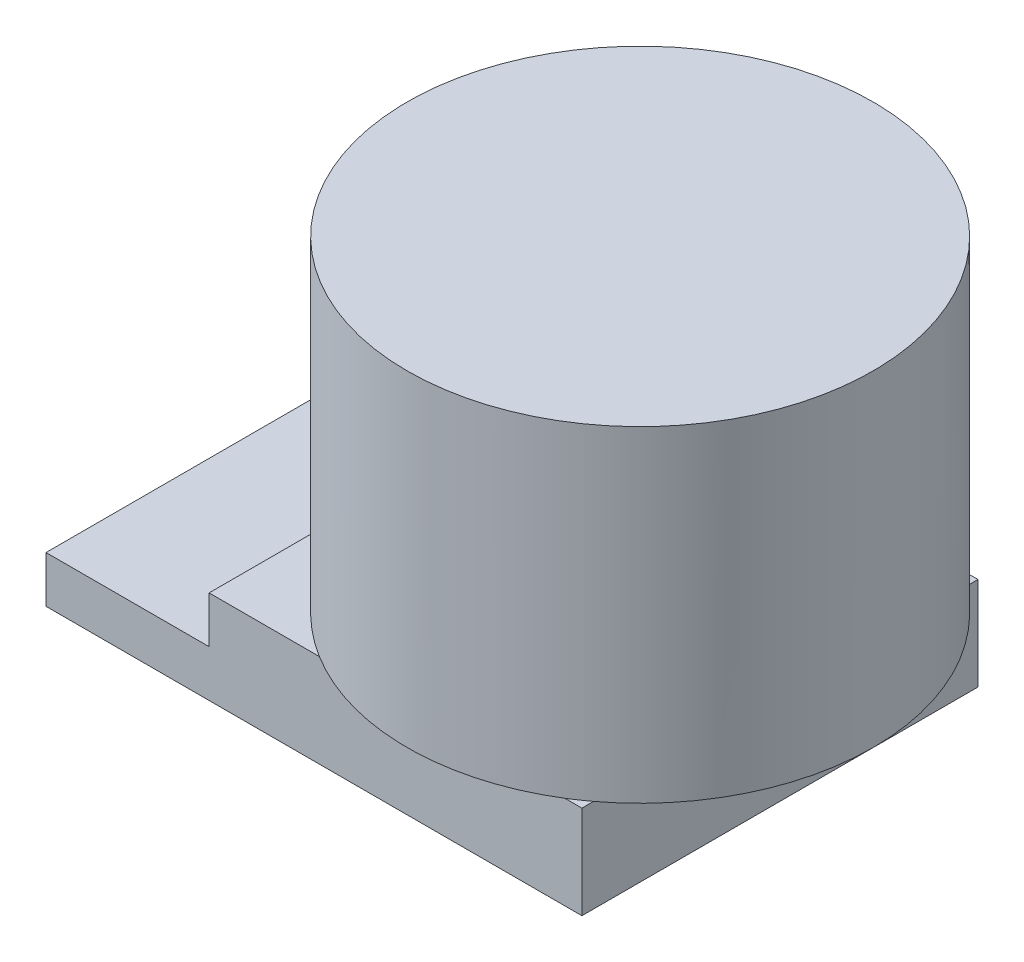
ISO-10303-21;
HEADER;
FILE_DESCRIPTION(('STEP AP214'),'2;1');
FILE_NAME('part.step','',(''),(''),'','','');
FILE_SCHEMA(('AUTOMOTIVE_DESIGN { 1 0 10303 214 1 1 1 1 }'));
ENDSEC;
DATA;
#1=APPLICATION_CONTEXT('core data for automotive mechanical design processes');
#2=APPLICATION_PROTOCOL_DEFINITION('international standard','automotive_design',2000,#1);
#3=PRODUCT_CONTEXT('',#1,'mechanical');
#4=PRODUCT('Part','Part','',(#3));
#5=PRODUCT_RELATED_PRODUCT_CATEGORY('part','',(#4));
#6=PRODUCT_DEFINITION_FORMATION('','',#4);
#7=PRODUCT_DEFINITION_CONTEXT('part definition',#1,'design');
#8=PRODUCT_DEFINITION('design','',#6,#7);
#9=PRODUCT_DEFINITION_SHAPE('','',#8);
#10=(LENGTH_UNIT() NAMED_UNIT(*) SI_UNIT(.MILLI.,.METRE.));
#11=(NAMED_UNIT(*) PLANE_ANGLE_UNIT() SI_UNIT($,.RADIAN.));
#12=(NAMED_UNIT(*) SI_UNIT($,.STERADIAN.) SOLID_ANGLE_UNIT());
#13=UNCERTAINTY_MEASURE_WITH_UNIT(LENGTH_MEASURE(1.E-05),#10,'distance_accuracy_value','');
#14=(GEOMETRIC_REPRESENTATION_CONTEXT(3) GLOBAL_UNCERTAINTY_ASSIGNED_CONTEXT((#13)) GLOBAL_UNIT_ASSIGNED_CONTEXT((#10,
#11,#12)) REPRESENTATION_CONTEXT('',''));
#15=CARTESIAN_POINT('',(0.,0.,0.));
#16=DIRECTION('',(0.,0.,1.));
#17=DIRECTION('',(1.,0.,0.));
#18=AXIS2_PLACEMENT_3D('',#15,#16,#17);
#19=CARTESIAN_POINT('',(-5.75,2.,-4.25));
#20=DIRECTION('',(1.,0.,0.));
#21=DIRECTION('',(0.,0.,-1.));
#22=AXIS2_PLACEMENT_3D('',#19,#20,#21);
#23=PLANE('',#22);
#24=DIRECTION('',(0.,0.,1.));
#25=VECTOR('',#24,1.);
#26=CARTESIAN_POINT('',(-5.75,1.,-4.25));
#27=LINE('',#26,#25);
#28=CARTESIAN_POINT('',(-5.75,1.,-4.25));
#29=VERTEX_POINT('',#28);
#30=CARTESIAN_POINT('',(-5.75,1.,4.25));
#31=VERTEX_POINT('',#30);
#32=EDGE_CURVE('E109',#29,#31,#27,.T.);
#33=ORIENTED_EDGE('',*,*,#32,.F.);
#34=DIRECTION('',(0.,-1.,0.));
#35=VECTOR('',#34,1.);
#36=CARTESIAN_POINT('',(-5.75,2.,-4.25));
#37=LINE('',#36,#35);
#38=CARTESIAN_POINT('',(-5.75,0.,-4.25));
#39=VERTEX_POINT('',#38);
#40=EDGE_CURVE('E143',#29,#39,#37,.T.);
#41=ORIENTED_EDGE('',*,*,#40,.T.);
#42=DIRECTION('',(0.,0.,1.));
#43=VECTOR('',#42,1.);
#44=CARTESIAN_POINT('',(-5.75,0.,-4.25));
#45=LINE('',#44,#43);
#46=CARTESIAN_POINT('',(-5.75,0.,4.25));
#47=VERTEX_POINT('',#46);
#48=EDGE_CURVE('E130',#39,#47,#45,.T.);
#49=ORIENTED_EDGE('',*,*,#48,.T.);
#50=DIRECTION('',(0.,-1.,0.));
#51=VECTOR('',#50,1.);
#52=CARTESIAN_POINT('',(-5.75,2.,4.25));
#53=LINE('',#52,#51);
#54=EDGE_CURVE('E36',#31,#47,#53,.T.);
#55=ORIENTED_EDGE('',*,*,#54,.F.);
#56=EDGE_LOOP('',(#33,#41,#49,#55));
#57=FACE_BOUND('',#56,.T.);
#58=ADVANCED_FACE('F33',(#57),#23,.F.);
#59=CARTESIAN_POINT('',(0.,2.,0.));
#60=DIRECTION('',(0.,1.,0.));
#61=DIRECTION('',(0.,0.,1.));
#62=AXIS2_PLACEMENT_3D('',#59,#60,#61);
#63=PLANE('',#62);
#64=DIRECTION('',(0.,0.,-1.));
#65=VECTOR('',#64,1.);
#66=CARTESIAN_POINT('',(-2.25,2.,-4.25));
#67=LINE('',#66,#65);
#68=CARTESIAN_POINT('',(-2.25,2.,4.25));
#69=VERTEX_POINT('',#68);
#70=CARTESIAN_POINT('',(-2.25,2.,0.));
#71=VERTEX_POINT('',#70);
#72=EDGE_CURVE('E50',#69,#71,#67,.T.);
#73=ORIENTED_EDGE('',*,*,#72,.F.);
#74=DIRECTION('',(1.,0.,0.));
#75=VECTOR('',#74,1.);
#76=CARTESIAN_POINT('',(-5.75,2.,4.25));
#77=LINE('',#76,#75);
#78=CARTESIAN_POINT('',(0.116086561786809,2.,4.25));
#79=VERTEX_POINT('',#78);
#80=EDGE_CURVE('E167',#69,#79,#77,.T.);
#81=ORIENTED_EDGE('',*,*,#80,.T.);
#82=CARTESIAN_POINT('',(2.75,2.,0.));
#83=DIRECTION('',(0.,1.,0.));
#84=DIRECTION('',(0.,0.,1.));
#85=AXIS2_PLACEMENT_3D('',#82,#83,#84);
#86=CIRCLE('',#85,5.);
#87=EDGE_CURVE('E131',#71,#79,#86,.T.);
#88=ORIENTED_EDGE('',*,*,#87,.F.);
#89=EDGE_LOOP('',(#73,#81,#88));
#90=FACE_BOUND('',#89,.T.);
#91=ADVANCED_FACE('F213',(#90),#63,.T.);
#92=CARTESIAN_POINT('',(5.38391343821319,2.,4.25));
#93=VERTEX_POINT('',#92);
#94=CARTESIAN_POINT('',(5.75,2.,4.));
#95=VERTEX_POINT('',#94);
#96=EDGE_CURVE('E135',#93,#95,#86,.T.);
#97=ORIENTED_EDGE('',*,*,#96,.F.);
#98=CARTESIAN_POINT('',(5.75,2.,4.25));
#99=VERTEX_POINT('',#98);
#100=EDGE_CURVE('E151',#93,#99,#77,.T.);
#101=ORIENTED_EDGE('',*,*,#100,.T.);
#102=DIRECTION('',(0.,0.,-1.));
#103=VECTOR('',#102,1.);
#104=CARTESIAN_POINT('',(5.75,2.,-4.25));
#105=LINE('',#104,#103);
#106=EDGE_CURVE('E162',#99,#95,#105,.T.);
#107=ORIENTED_EDGE('',*,*,#106,.T.);
#108=EDGE_LOOP('',(#97,#101,#107));
#109=FACE_BOUND('',#108,.T.);
#110=ADVANCED_FACE('F195',(#109),#63,.T.);
#111=CARTESIAN_POINT('',(5.75,2.,-4.));
#112=VERTEX_POINT('',#111);
#113=CARTESIAN_POINT('',(5.38391343821319,2.,-4.25));
#114=VERTEX_POINT('',#113);
#115=EDGE_CURVE('E11',#112,#114,#86,.T.);
#116=ORIENTED_EDGE('',*,*,#115,.F.);
#117=CARTESIAN_POINT('',(5.75,2.,-4.25));
#118=VERTEX_POINT('',#117);
#119=EDGE_CURVE('E166',#112,#118,#105,.T.);
#120=ORIENTED_EDGE('',*,*,#119,.T.);
#121=DIRECTION('',(-1.,0.,0.));
#122=VECTOR('',#121,1.);
#123=CARTESIAN_POINT('',(-5.75,2.,-4.25));
#124=LINE('',#123,#122);
#125=EDGE_CURVE('E147',#118,#114,#124,.T.);
#126=ORIENTED_EDGE('',*,*,#125,.T.);
#127=EDGE_LOOP('',(#116,#120,#126));
#128=FACE_BOUND('',#127,.T.);
#129=ADVANCED_FACE('F233',(#128),#63,.T.);
#130=CARTESIAN_POINT('',(-5.75,2.,4.25));
#131=DIRECTION('',(0.,0.,-1.));
#132=DIRECTION('',(-1.,0.,0.));
#133=AXIS2_PLACEMENT_3D('',#130,#131,#132);
#134=PLANE('',#133);
#135=ORIENTED_EDGE('',*,*,#80,.F.);
#136=DIRECTION('',(0.,1.,0.));
#137=VECTOR('',#136,1.);
#138=CARTESIAN_POINT('',(-2.25,1.,4.25));
#139=LINE('',#138,#137);
#140=CARTESIAN_POINT('',(-2.25,1.,4.25));
#141=VERTEX_POINT('',#140);
#142=EDGE_CURVE('E125',#141,#69,#139,.T.);
#143=ORIENTED_EDGE('',*,*,#142,.F.);
#144=DIRECTION('',(1.,0.,0.));
#145=VECTOR('',#144,1.);
#146=CARTESIAN_POINT('',(-5.75,1.,4.25));
#147=LINE('',#146,#145);
#148=EDGE_CURVE('E113',#31,#141,#147,.T.);
#149=ORIENTED_EDGE('',*,*,#148,.F.);
#150=ORIENTED_EDGE('',*,*,#54,.T.);
#151=DIRECTION('',(1.,0.,0.));
#152=VECTOR('',#151,1.);
#153=CARTESIAN_POINT('',(-5.75,0.,4.25));
#154=LINE('',#153,#152);
#155=CARTESIAN_POINT('',(5.75,0.,4.25));
#156=VERTEX_POINT('',#155);
#157=EDGE_CURVE('E154',#47,#156,#154,.T.);
#158=ORIENTED_EDGE('',*,*,#157,.T.);
#159=DIRECTION('',(0.,-1.,0.));
#160=VECTOR('',#159,1.);
#161=CARTESIAN_POINT('',(5.75,2.,4.25));
#162=LINE('',#161,#160);
#163=EDGE_CURVE('E132',#99,#156,#162,.T.);
#164=ORIENTED_EDGE('',*,*,#163,.F.);
#165=ORIENTED_EDGE('',*,*,#100,.F.);
#166=EDGE_CURVE('E168',#79,#93,#77,.T.);
#167=ORIENTED_EDGE('',*,*,#166,.F.);
#168=EDGE_LOOP('',(#135,#143,#149,#150,#158,#164,#165,#167));
#169=FACE_BOUND('',#168,.T.);
#170=ADVANCED_FACE('F123',(#169),#134,.F.);
#171=CARTESIAN_POINT('',(5.75,2.,-4.25));
#172=DIRECTION('',(-1.,0.,0.));
#173=DIRECTION('',(0.,0.,1.));
#174=AXIS2_PLACEMENT_3D('',#171,#172,#173);
#175=PLANE('',#174);
#176=DIRECTION('',(0.,0.,-1.));
#177=VECTOR('',#176,1.);
#178=CARTESIAN_POINT('',(5.75,0.,-4.25));
#179=LINE('',#178,#177);
#180=CARTESIAN_POINT('',(5.75,0.,-4.25));
#181=VERTEX_POINT('',#180);
#182=EDGE_CURVE('E152',#156,#181,#179,.T.);
#183=ORIENTED_EDGE('',*,*,#182,.T.);
#184=DIRECTION('',(0.,-1.,0.));
#185=VECTOR('',#184,1.);
#186=CARTESIAN_POINT('',(5.75,2.,-4.25));
#187=LINE('',#186,#185);
#188=EDGE_CURVE('E137',#118,#181,#187,.T.);
#189=ORIENTED_EDGE('',*,*,#188,.F.);
#190=ORIENTED_EDGE('',*,*,#119,.F.);
#191=EDGE_CURVE('E165',#95,#112,#105,.T.);
#192=ORIENTED_EDGE('',*,*,#191,.F.);
#193=ORIENTED_EDGE('',*,*,#106,.F.);
#194=ORIENTED_EDGE('',*,*,#163,.T.);
#195=EDGE_LOOP('',(#183,#189,#190,#192,#193,#194));
#196=FACE_BOUND('',#195,.T.);
#197=ADVANCED_FACE('F190',(#196),#175,.F.);
#198=CARTESIAN_POINT('',(-5.75,2.,-4.25));
#199=DIRECTION('',(0.,0.,1.));
#200=DIRECTION('',(1.,0.,0.));
#201=AXIS2_PLACEMENT_3D('',#198,#199,#200);
#202=PLANE('',#201);
#203=DIRECTION('',(-1.,0.,0.));
#204=VECTOR('',#203,1.);
#205=CARTESIAN_POINT('',(-5.75,1.,-4.25));
#206=LINE('',#205,#204);
#207=CARTESIAN_POINT('',(-2.25,1.,-4.25));
#208=VERTEX_POINT('',#207);
#209=EDGE_CURVE('E116',#208,#29,#206,.T.);
#210=ORIENTED_EDGE('',*,*,#209,.F.);
#211=DIRECTION('',(0.,1.,0.));
#212=VECTOR('',#211,1.);
#213=CARTESIAN_POINT('',(-2.25,1.,-4.25));
#214=LINE('',#213,#212);
#215=CARTESIAN_POINT('',(-2.25,2.,-4.25));
#216=VERTEX_POINT('',#215);
#217=EDGE_CURVE('E174',#208,#216,#214,.T.);
#218=ORIENTED_EDGE('',*,*,#217,.T.);
#219=CARTESIAN_POINT('',(0.116086561786809,2.,-4.25));
#220=VERTEX_POINT('',#219);
#221=EDGE_CURVE('E161',#220,#216,#124,.T.);
#222=ORIENTED_EDGE('',*,*,#221,.F.);
#223=EDGE_CURVE('E160',#114,#220,#124,.T.);
#224=ORIENTED_EDGE('',*,*,#223,.F.);
#225=ORIENTED_EDGE('',*,*,#125,.F.);
#226=ORIENTED_EDGE('',*,*,#188,.T.);
#227=DIRECTION('',(-1.,0.,0.));
#228=VECTOR('',#227,1.);
#229=CARTESIAN_POINT('',(-5.75,0.,-4.25));
#230=LINE('',#229,#228);
#231=EDGE_CURVE('E148',#181,#39,#230,.T.);
#232=ORIENTED_EDGE('',*,*,#231,.T.);
#233=ORIENTED_EDGE('',*,*,#40,.F.);
#234=EDGE_LOOP('',(#210,#218,#222,#224,#225,#226,#232,#233));
#235=FACE_BOUND('',#234,.T.);
#236=ADVANCED_FACE('F181',(#235),#202,.F.);
#237=EDGE_CURVE('E178',#71,#216,#67,.T.);
#238=ORIENTED_EDGE('',*,*,#237,.F.);
#239=EDGE_CURVE('E41',#220,#71,#86,.T.);
#240=ORIENTED_EDGE('',*,*,#239,.F.);
#241=ORIENTED_EDGE('',*,*,#221,.T.);
#242=EDGE_LOOP('',(#238,#240,#241));
#243=FACE_BOUND('',#242,.T.);
#244=ADVANCED_FACE('F211',(#243),#63,.T.);
#245=CARTESIAN_POINT('',(0.,0.,0.));
#246=DIRECTION('',(0.,1.,0.));
#247=DIRECTION('',(0.,0.,1.));
#248=AXIS2_PLACEMENT_3D('',#245,#246,#247);
#249=PLANE('',#248);
#250=ORIENTED_EDGE('',*,*,#48,.F.);
#251=ORIENTED_EDGE('',*,*,#231,.F.);
#252=ORIENTED_EDGE('',*,*,#182,.F.);
#253=ORIENTED_EDGE('',*,*,#157,.F.);
#254=EDGE_LOOP('',(#250,#251,#252,#253));
#255=FACE_BOUND('',#254,.T.);
#256=ADVANCED_FACE('F186',(#255),#249,.F.);
#257=CARTESIAN_POINT('',(2.75,2.,0.));
#258=DIRECTION('',(0.,1.,0.));
#259=DIRECTION('',(0.,0.,1.));
#260=AXIS2_PLACEMENT_3D('',#257,#258,#259);
#261=PLANE('',#260);
#262=EDGE_CURVE('E134',#79,#93,#86,.T.);
#263=ORIENTED_EDGE('',*,*,#262,.F.);
#264=ORIENTED_EDGE('',*,*,#166,.T.);
#265=EDGE_LOOP('',(#263,#264));
#266=FACE_BOUND('',#265,.T.);
#267=ADVANCED_FACE('F214',(#266),#261,.F.);
#268=EDGE_CURVE('E43',#95,#112,#86,.T.);
#269=ORIENTED_EDGE('',*,*,#268,.F.);
#270=ORIENTED_EDGE('',*,*,#191,.T.);
#271=EDGE_LOOP('',(#269,#270));
#272=FACE_BOUND('',#271,.T.);
#273=ADVANCED_FACE('F198',(#272),#261,.F.);
#274=EDGE_CURVE('E200',#114,#220,#86,.T.);
#275=ORIENTED_EDGE('',*,*,#274,.F.);
#276=ORIENTED_EDGE('',*,*,#223,.T.);
#277=EDGE_LOOP('',(#275,#276));
#278=FACE_BOUND('',#277,.T.);
#279=ADVANCED_FACE('F210',(#278),#261,.F.);
#280=CARTESIAN_POINT('',(2.75,9.,0.));
#281=DIRECTION('',(0.,-1.,0.));
#282=DIRECTION('',(0.,0.,-1.));
#283=AXIS2_PLACEMENT_3D('',#280,#281,#282);
#284=CYLINDRICAL_SURFACE('',#283,5.);
#285=CARTESIAN_POINT('',(2.75,9.,0.));
#286=DIRECTION('',(0.,1.,0.));
#287=DIRECTION('',(0.,0.,1.));
#288=AXIS2_PLACEMENT_3D('',#285,#286,#287);
#289=CIRCLE('',#288,5.);
#290=CARTESIAN_POINT('',(2.75,9.,5.));
#291=VERTEX_POINT('',#290);
#292=EDGE_CURVE('E157',#291,#291,#289,.T.);
#293=ORIENTED_EDGE('',*,*,#292,.F.);
#294=EDGE_LOOP('',(#293));
#295=FACE_BOUND('',#294,.T.);
#296=ORIENTED_EDGE('',*,*,#96,.T.);
#297=ORIENTED_EDGE('',*,*,#268,.T.);
#298=ORIENTED_EDGE('',*,*,#115,.T.);
#299=ORIENTED_EDGE('',*,*,#274,.T.);
#300=ORIENTED_EDGE('',*,*,#239,.T.);
#301=ORIENTED_EDGE('',*,*,#87,.T.);
#302=ORIENTED_EDGE('',*,*,#262,.T.);
#303=EDGE_LOOP('',(#296,#297,#298,#299,#300,#301,#302));
#304=FACE_BOUND('',#303,.T.);
#305=ADVANCED_FACE('F202',(#295,#304),#284,.T.);
#306=CARTESIAN_POINT('',(2.75,9.,0.));
#307=DIRECTION('',(0.,1.,0.));
#308=DIRECTION('',(0.,0.,1.));
#309=AXIS2_PLACEMENT_3D('',#306,#307,#308);
#310=PLANE('',#309);
#311=ORIENTED_EDGE('',*,*,#292,.T.);
#312=EDGE_LOOP('',(#311));
#313=FACE_BOUND('',#312,.T.);
#314=ADVANCED_FACE('F270',(#313),#310,.T.);
#315=CARTESIAN_POINT('',(-2.25,1.,-4.25));
#316=DIRECTION('',(1.,0.,0.));
#317=DIRECTION('',(0.,0.,-1.));
#318=AXIS2_PLACEMENT_3D('',#315,#316,#317);
#319=PLANE('',#318);
#320=ORIENTED_EDGE('',*,*,#72,.T.);
#321=ORIENTED_EDGE('',*,*,#237,.T.);
#322=ORIENTED_EDGE('',*,*,#217,.F.);
#323=DIRECTION('',(0.,0.,-1.));
#324=VECTOR('',#323,1.);
#325=CARTESIAN_POINT('',(-2.25,1.,-4.25));
#326=LINE('',#325,#324);
#327=EDGE_CURVE('E126',#141,#208,#326,.T.);
#328=ORIENTED_EDGE('',*,*,#327,.F.);
#329=ORIENTED_EDGE('',*,*,#142,.T.);
#330=EDGE_LOOP('',(#320,#321,#322,#328,#329));
#331=FACE_BOUND('',#330,.T.);
#332=ADVANCED_FACE('F278',(#331),#319,.F.);
#333=CARTESIAN_POINT('',(0.,1.,0.));
#334=DIRECTION('',(0.,1.,0.));
#335=DIRECTION('',(0.,0.,1.));
#336=AXIS2_PLACEMENT_3D('',#333,#334,#335);
#337=PLANE('',#336);
#338=ORIENTED_EDGE('',*,*,#32,.T.);
#339=ORIENTED_EDGE('',*,*,#148,.T.);
#340=ORIENTED_EDGE('',*,*,#327,.T.);
#341=ORIENTED_EDGE('',*,*,#209,.T.);
#342=EDGE_LOOP('',(#338,#339,#340,#341));
#343=FACE_BOUND('',#342,.T.);
#344=ADVANCED_FACE('F111',(#343),#337,.T.);
#345=CLOSED_SHELL('',(#58,#91,#110,#129,#170,#197,#236,#244,#256,#267,#273,#279,#305,#314,#332,#344));
#346=MANIFOLD_SOLID_BREP('B2',#345);
#347=ADVANCED_BREP_SHAPE_REPRESENTATION('',(#18,#346),#14);
#348=SHAPE_DEFINITION_REPRESENTATION(#9,#347);
ENDSEC;
END-ISO-10303-21;
